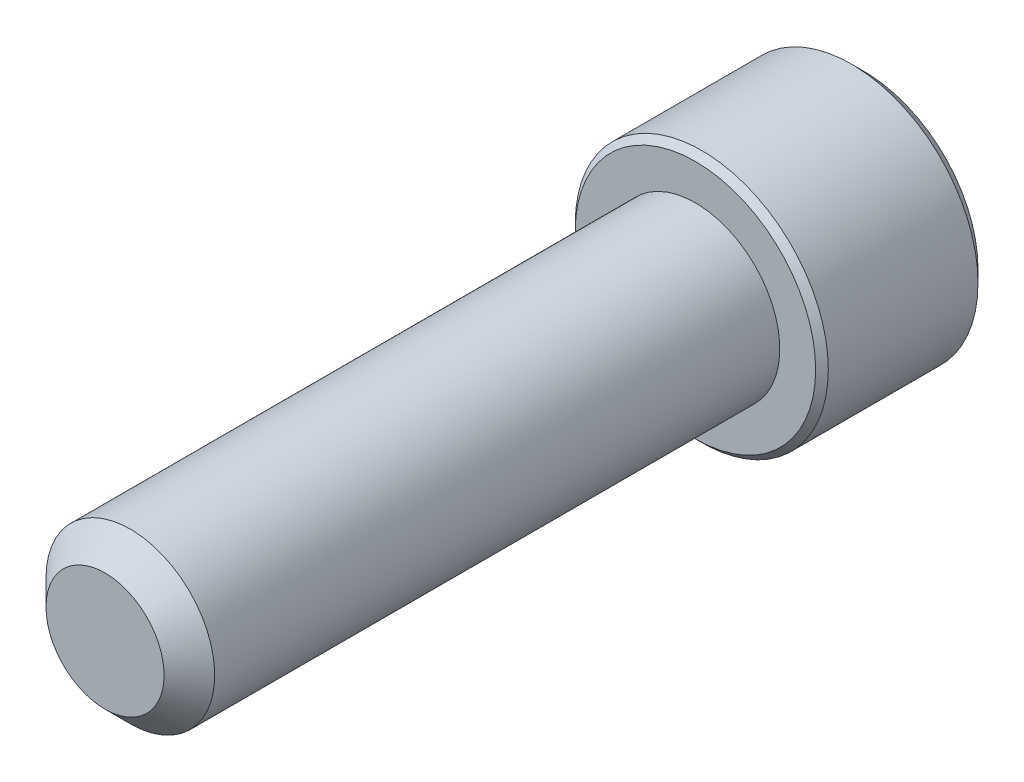
ISO-10303-21;
HEADER;
FILE_DESCRIPTION(('STEP AP214'),'2;1');
FILE_NAME('part.step','',(''),(''),'','','');
FILE_SCHEMA(('AUTOMOTIVE_DESIGN { 1 0 10303 214 1 1 1 1 }'));
ENDSEC;
DATA;
#1=APPLICATION_CONTEXT('core data for automotive mechanical design processes');
#2=APPLICATION_PROTOCOL_DEFINITION('international standard','automotive_design',2000,#1);
#3=PRODUCT_CONTEXT('',#1,'mechanical');
#4=PRODUCT('Part','Part','',(#3));
#5=PRODUCT_RELATED_PRODUCT_CATEGORY('part','',(#4));
#6=PRODUCT_DEFINITION_FORMATION('','',#4);
#7=PRODUCT_DEFINITION_CONTEXT('part definition',#1,'design');
#8=PRODUCT_DEFINITION('design','',#6,#7);
#9=PRODUCT_DEFINITION_SHAPE('','',#8);
#10=(LENGTH_UNIT() NAMED_UNIT(*) SI_UNIT(.MILLI.,.METRE.));
#11=(NAMED_UNIT(*) PLANE_ANGLE_UNIT() SI_UNIT($,.RADIAN.));
#12=(NAMED_UNIT(*) SI_UNIT($,.STERADIAN.) SOLID_ANGLE_UNIT());
#13=UNCERTAINTY_MEASURE_WITH_UNIT(LENGTH_MEASURE(1.E-05),#10,'distance_accuracy_value','');
#14=(GEOMETRIC_REPRESENTATION_CONTEXT(3) GLOBAL_UNCERTAINTY_ASSIGNED_CONTEXT((#13)) GLOBAL_UNIT_ASSIGNED_CONTEXT((#10,
#11,#12)) REPRESENTATION_CONTEXT('',''));
#15=CARTESIAN_POINT('',(0.,0.,0.));
#16=DIRECTION('',(0.,0.,1.));
#17=DIRECTION('',(1.,0.,0.));
#18=AXIS2_PLACEMENT_3D('',#15,#16,#17);
#19=CARTESIAN_POINT('',(0.,0.,-22.225));
#20=DIRECTION('',(0.,0.,1.));
#21=DIRECTION('',(1.,0.,0.));
#22=AXIS2_PLACEMENT_3D('',#19,#20,#21);
#23=CYLINDRICAL_SURFACE('',#22,3.175);
#24=CARTESIAN_POINT('',(0.,0.,-0.952500000000002));
#25=DIRECTION('',(0.,0.,1.));
#26=DIRECTION('',(1.,0.,0.));
#27=AXIS2_PLACEMENT_3D('',#24,#25,#26);
#28=CIRCLE('',#27,3.175);
#29=CARTESIAN_POINT('',(-3.175,0.,-0.952500000000002));
#30=VERTEX_POINT('',#29);
#31=EDGE_CURVE('E108',#30,#30,#28,.F.);
#32=ORIENTED_EDGE('',*,*,#31,.T.);
#33=EDGE_LOOP('',(#32));
#34=FACE_BOUND('',#33,.T.);
#35=CARTESIAN_POINT('',(0.,0.,-22.225));
#36=DIRECTION('',(0.,0.,-1.));
#37=DIRECTION('',(-1.,0.,0.));
#38=AXIS2_PLACEMENT_3D('',#35,#36,#37);
#39=CIRCLE('',#38,3.175);
#40=CARTESIAN_POINT('',(-3.175,0.,-22.225));
#41=VERTEX_POINT('',#40);
#42=EDGE_CURVE('E211',#41,#41,#39,.F.);
#43=ORIENTED_EDGE('',*,*,#42,.T.);
#44=EDGE_LOOP('',(#43));
#45=FACE_BOUND('',#44,.T.);
#46=ADVANCED_FACE('F34',(#34,#45),#23,.T.);
#47=CARTESIAN_POINT('',(0.,0.,0.));
#48=DIRECTION('',(0.,0.,1.));
#49=DIRECTION('',(1.,0.,0.));
#50=AXIS2_PLACEMENT_3D('',#47,#48,#49);
#51=PLANE('',#50);
#52=CARTESIAN_POINT('',(0.,0.,0.));
#53=DIRECTION('',(0.,0.,1.));
#54=DIRECTION('',(1.,0.,0.));
#55=AXIS2_PLACEMENT_3D('',#52,#53,#54);
#56=CIRCLE('',#55,2.2225);
#57=CARTESIAN_POINT('',(-2.2225,0.,0.));
#58=VERTEX_POINT('',#57);
#59=EDGE_CURVE('E210',#58,#58,#56,.T.);
#60=ORIENTED_EDGE('',*,*,#59,.T.);
#61=EDGE_LOOP('',(#60));
#62=FACE_BOUND('',#61,.T.);
#63=ADVANCED_FACE('F188',(#62),#51,.T.);
#64=CARTESIAN_POINT('',(0.,0.,0.));
#65=DIRECTION('',(0.,0.,-1.));
#66=DIRECTION('',(-1.,0.,0.));
#67=AXIS2_PLACEMENT_3D('',#64,#65,#66);
#68=CONICAL_SURFACE('',#67,2.2225,0.785398163397446);
#69=CARTESIAN_POINT('',(-3.175,0.,-0.952500000000002));
#70=CARTESIAN_POINT('',(-3.165078125,0.,-0.942578125000002));
#71=CARTESIAN_POINT('',(-3.15515625,0.,-0.932656250000002));
#72=CARTESIAN_POINT('',(-3.1353125,0.,-0.912812500000002));
#73=CARTESIAN_POINT('',(-3.125390625,0.,-0.902890625000002));
#74=CARTESIAN_POINT('',(-3.105546875,0.,-0.883046875000002));
#75=CARTESIAN_POINT('',(-3.095625,0.,-0.873125000000002));
#76=CARTESIAN_POINT('',(-3.07578125,0.,-0.853281250000002));
#77=CARTESIAN_POINT('',(-3.065859375,0.,-0.843359375000002));
#78=CARTESIAN_POINT('',(-3.046015625,0.,-0.823515625000002));
#79=CARTESIAN_POINT('',(-3.03609375,0.,-0.813593750000002));
#80=CARTESIAN_POINT('',(-3.01625,0.,-0.793750000000002));
#81=CARTESIAN_POINT('',(-3.006328125,0.,-0.783828125000002));
#82=CARTESIAN_POINT('',(-2.986484375,0.,-0.763984375000002));
#83=CARTESIAN_POINT('',(-2.9765625,0.,-0.754062500000002));
#84=CARTESIAN_POINT('',(-2.95671875,0.,-0.734218750000002));
#85=CARTESIAN_POINT('',(-2.946796875,0.,-0.724296875000002));
#86=CARTESIAN_POINT('',(-2.926953125,0.,-0.704453125000002));
#87=CARTESIAN_POINT('',(-2.91703125,0.,-0.694531250000002));
#88=CARTESIAN_POINT('',(-2.8971875,0.,-0.674687500000001));
#89=CARTESIAN_POINT('',(-2.887265625,0.,-0.664765625000001));
#90=CARTESIAN_POINT('',(-2.867421875,0.,-0.644921875000001));
#91=CARTESIAN_POINT('',(-2.8575,0.,-0.635000000000001));
#92=CARTESIAN_POINT('',(-2.83765625,0.,-0.615156250000001));
#93=CARTESIAN_POINT('',(-2.827734375,0.,-0.605234375000001));
#94=CARTESIAN_POINT('',(-2.807890625,0.,-0.585390625000001));
#95=CARTESIAN_POINT('',(-2.79796875,0.,-0.575468750000001));
#96=CARTESIAN_POINT('',(-2.778125,0.,-0.555625000000001));
#97=CARTESIAN_POINT('',(-2.768203125,0.,-0.545703125000001));
#98=CARTESIAN_POINT('',(-2.748359375,0.,-0.525859375000001));
#99=CARTESIAN_POINT('',(-2.7384375,0.,-0.515937500000001));
#100=CARTESIAN_POINT('',(-2.71859375,0.,-0.496093750000001));
#101=CARTESIAN_POINT('',(-2.708671875,0.,-0.486171875000001));
#102=CARTESIAN_POINT('',(-2.688828125,0.,-0.466328125000001));
#103=CARTESIAN_POINT('',(-2.67890625,0.,-0.456406250000001));
#104=CARTESIAN_POINT('',(-2.6590625,0.,-0.436562500000001));
#105=CARTESIAN_POINT('',(-2.649140625,0.,-0.426640625000001));
#106=CARTESIAN_POINT('',(-2.629296875,0.,-0.406796875000001));
#107=CARTESIAN_POINT('',(-2.619375,0.,-0.396875000000001));
#108=CARTESIAN_POINT('',(-2.59953125,0.,-0.377031250000001));
#109=CARTESIAN_POINT('',(-2.589609375,0.,-0.367109375000001));
#110=CARTESIAN_POINT('',(-2.569765625,0.,-0.347265625000001));
#111=CARTESIAN_POINT('',(-2.55984375,0.,-0.337343750000001));
#112=CARTESIAN_POINT('',(-2.54,0.,-0.317500000000001));
#113=CARTESIAN_POINT('',(-2.530078125,0.,-0.307578125000001));
#114=CARTESIAN_POINT('',(-2.510234375,0.,-0.287734375000001));
#115=CARTESIAN_POINT('',(-2.5003125,0.,-0.277812500000001));
#116=CARTESIAN_POINT('',(-2.48046875,0.,-0.257968750000001));
#117=CARTESIAN_POINT('',(-2.470546875,0.,-0.248046875));
#118=CARTESIAN_POINT('',(-2.450703125,0.,-0.228203125));
#119=CARTESIAN_POINT('',(-2.44078125,0.,-0.21828125));
#120=CARTESIAN_POINT('',(-2.4209375,0.,-0.1984375));
#121=CARTESIAN_POINT('',(-2.411015625,0.,-0.188515625));
#122=CARTESIAN_POINT('',(-2.391171875,0.,-0.168671875));
#123=CARTESIAN_POINT('',(-2.38125,0.,-0.15875));
#124=CARTESIAN_POINT('',(-2.36140625,0.,-0.13890625));
#125=CARTESIAN_POINT('',(-2.351484375,0.,-0.128984375));
#126=CARTESIAN_POINT('',(-2.331640625,0.,-0.109140625));
#127=CARTESIAN_POINT('',(-2.32171875,0.,-0.0992187500000001));
#128=CARTESIAN_POINT('',(-2.301875,0.,-0.0793750000000001));
#129=CARTESIAN_POINT('',(-2.291953125,0.,-0.0694531250000002));
#130=CARTESIAN_POINT('',(-2.272109375,0.,-0.0496093750000001));
#131=CARTESIAN_POINT('',(-2.2621875,0.,-0.0396875000000001));
#132=CARTESIAN_POINT('',(-2.24234375,0.,-0.01984375));
#133=CARTESIAN_POINT('',(-2.232421875,0.,-0.00992187499999998));
#134=CARTESIAN_POINT('',(-2.2225,0.,0.));
#135=B_SPLINE_CURVE_WITH_KNOTS('',3,(#69,#70,#71,#72,#73,#74,#75,#76,#77,#78,#79,#80,#81,#82,
#83,#84,#85,#86,#87,#88,#89,#90,#91,#92,#93,#94,#95,#96,#97,#98,#99,#100,#101,#102,#103,#104,
#105,#106,#107,#108,#109,#110,#111,#112,#113,#114,#115,#116,#117,#118,#119,#120,#121,#122,#123,
#124,#125,#126,#127,#128,#129,#130,#131,#132,#133,#134),.UNSPECIFIED.,.F.,.F.,(4,2,2,2,2,2,2,2,
2,2,2,2,2,2,2,2,2,2,2,2,2,2,2,2,2,2,2,2,2,2,2,2,4),(0.,0.0420949505675116,0.0841899011350232,
0.126284851702535,0.168379802270046,0.210474752837558,0.25256970340507,0.294664653972581,
0.336759604540093,0.378854555107605,0.420949505675116,0.463044456242628,0.50513940681014,
0.547234357377651,0.589329307945163,0.631424258512675,0.673519209080186,0.715614159647698,
0.75770911021521,0.799804060782721,0.841899011350233,0.883993961917745,0.926088912485256,
0.968183863052768,1.01027881362028,1.05237376418779,1.0944687147553,1.13656366532281,
1.17865861589033,1.22075356645784,1.26284851702535,1.30494346759286,1.34703841816037),.UNSPECIFIED.);
#136=EDGE_CURVE('BSEAM194',#30,#58,#135,.T.);
#137=ORIENTED_EDGE('',*,*,#31,.F.);
#138=ORIENTED_EDGE('',*,*,#59,.F.);
#139=ORIENTED_EDGE('',*,*,#136,.T.);
#140=ORIENTED_EDGE('',*,*,#136,.F.);
#141=EDGE_LOOP('',(#137,#139,#138,#140));
#142=FACE_BOUND('',#141,.T.);
#143=ADVANCED_FACE('F194',(#142),#68,.T.);
#144=CARTESIAN_POINT('',(0.,0.,-28.575));
#145=DIRECTION('',(0.,0.,1.));
#146=DIRECTION('',(1.,0.,0.));
#147=AXIS2_PLACEMENT_3D('',#144,#145,#146);
#148=CYLINDRICAL_SURFACE('',#147,4.7625);
#149=CARTESIAN_POINT('',(0.,0.,-22.463125));
#150=DIRECTION('',(0.,0.,-1.));
#151=DIRECTION('',(-1.,0.,0.));
#152=AXIS2_PLACEMENT_3D('',#149,#150,#151);
#153=CIRCLE('',#152,4.7625);
#154=CARTESIAN_POINT('',(-4.7625,0.,-22.463125));
#155=VERTEX_POINT('',#154);
#156=EDGE_CURVE('E42',#155,#155,#153,.T.);
#157=ORIENTED_EDGE('',*,*,#156,.T.);
#158=EDGE_LOOP('',(#157));
#159=FACE_BOUND('',#158,.T.);
#160=CARTESIAN_POINT('',(0.,0.,-28.09875));
#161=DIRECTION('',(0.,0.,-1.));
#162=DIRECTION('',(-1.,0.,0.));
#163=AXIS2_PLACEMENT_3D('',#160,#161,#162);
#164=CIRCLE('',#163,4.7625);
#165=CARTESIAN_POINT('',(4.7625,0.,-28.09875));
#166=VERTEX_POINT('',#165);
#167=EDGE_CURVE('E171',#166,#166,#164,.F.);
#168=ORIENTED_EDGE('',*,*,#167,.T.);
#169=EDGE_LOOP('',(#168));
#170=FACE_BOUND('',#169,.T.);
#171=ADVANCED_FACE('F176',(#159,#170),#148,.T.);
#172=CARTESIAN_POINT('',(0.,0.,-28.575));
#173=DIRECTION('',(0.,0.,-1.));
#174=DIRECTION('',(-1.,0.,0.));
#175=AXIS2_PLACEMENT_3D('',#172,#173,#174);
#176=PLANE('',#175);
#177=CARTESIAN_POINT('',(0.,0.,-28.575));
#178=DIRECTION('',(0.,0.,-1.));
#179=DIRECTION('',(-1.,0.,0.));
#180=AXIS2_PLACEMENT_3D('',#177,#178,#179);
#181=CIRCLE('',#180,4.28624999999999);
#182=CARTESIAN_POINT('',(4.28625,0.,-28.575));
#183=VERTEX_POINT('',#182);
#184=EDGE_CURVE('E107',#183,#183,#181,.T.);
#185=ORIENTED_EDGE('',*,*,#184,.T.);
#186=EDGE_LOOP('',(#185));
#187=FACE_BOUND('',#186,.T.);
#188=CARTESIAN_POINT('',(0.,0.,-28.575));
#189=DIRECTION('',(0.,0.,-1.));
#190=DIRECTION('',(-1.,0.,0.));
#191=AXIS2_PLACEMENT_3D('',#188,#189,#190);
#192=CIRCLE('',#191,2.74963065701559);
#193=CARTESIAN_POINT('',(-2.38125,1.37481532850779,-28.575));
#194=VERTEX_POINT('',#193);
#195=CARTESIAN_POINT('',(0.,2.74963065701559,-28.575));
#196=VERTEX_POINT('',#195);
#197=EDGE_CURVE('E88',#194,#196,#192,.T.);
#198=ORIENTED_EDGE('',*,*,#197,.F.);
#199=CARTESIAN_POINT('',(-2.38125,-1.3748153285078,-28.575));
#200=VERTEX_POINT('',#199);
#201=EDGE_CURVE('E48',#200,#194,#192,.T.);
#202=ORIENTED_EDGE('',*,*,#201,.F.);
#203=CARTESIAN_POINT('',(0.,-2.74963065701559,-28.575));
#204=VERTEX_POINT('',#203);
#205=EDGE_CURVE('E270',#204,#200,#192,.T.);
#206=ORIENTED_EDGE('',*,*,#205,.F.);
#207=CARTESIAN_POINT('',(2.38125,-1.3748153285078,-28.575));
#208=VERTEX_POINT('',#207);
#209=EDGE_CURVE('E55',#208,#204,#192,.T.);
#210=ORIENTED_EDGE('',*,*,#209,.F.);
#211=CARTESIAN_POINT('',(2.38125,1.3748153285078,-28.575));
#212=VERTEX_POINT('',#211);
#213=EDGE_CURVE('E129',#212,#208,#192,.T.);
#214=ORIENTED_EDGE('',*,*,#213,.F.);
#215=EDGE_CURVE('E97',#196,#212,#192,.T.);
#216=ORIENTED_EDGE('',*,*,#215,.F.);
#217=EDGE_LOOP('',(#198,#202,#206,#210,#214,#216));
#218=FACE_BOUND('',#217,.T.);
#219=ADVANCED_FACE('F128',(#187,#218),#176,.T.);
#220=CARTESIAN_POINT('',(0.,0.,-22.225));
#221=DIRECTION('',(0.,0.,-1.));
#222=DIRECTION('',(-1.,0.,0.));
#223=AXIS2_PLACEMENT_3D('',#220,#221,#222);
#224=PLANE('',#223);
#225=CARTESIAN_POINT('',(0.,0.,-22.225));
#226=DIRECTION('',(0.,0.,-1.));
#227=DIRECTION('',(-1.,0.,0.));
#228=AXIS2_PLACEMENT_3D('',#225,#226,#227);
#229=CIRCLE('',#228,4.524375);
#230=CARTESIAN_POINT('',(-4.524375,0.,-22.225));
#231=VERTEX_POINT('',#230);
#232=EDGE_CURVE('E11',#231,#231,#229,.F.);
#233=ORIENTED_EDGE('',*,*,#232,.T.);
#234=EDGE_LOOP('',(#233));
#235=FACE_BOUND('',#234,.T.);
#236=ORIENTED_EDGE('',*,*,#42,.F.);
#237=EDGE_LOOP('',(#236));
#238=FACE_BOUND('',#237,.T.);
#239=ADVANCED_FACE('F282',(#235,#238),#224,.F.);
#240=CARTESIAN_POINT('',(0.,0.,-28.575));
#241=DIRECTION('',(0.,0.,-1.));
#242=DIRECTION('',(-1.,0.,0.));
#243=AXIS2_PLACEMENT_3D('',#240,#241,#242);
#244=CONICAL_SURFACE('',#243,2.74963065701559,0.78539816339745);
#245=ORIENTED_EDGE('',*,*,#215,.T.);
#246=CARTESIAN_POINT('',(-0.000199999999998987,2.74974612706943,-28.5751154773272));
#247=CARTESIAN_POINT('',(0.0816567823790509,2.70248609172789,-28.5278948967095));
#248=CARTESIAN_POINT('',(0.164882333771761,2.65443579722785,-28.4834475752929));
#249=CARTESIAN_POINT('',(0.334588480838039,2.556455907536,-28.4020654569856));
#250=CARTESIAN_POINT('',(0.421085217353101,2.50651699342501,-28.3651759430951));
#251=CARTESIAN_POINT('',(0.59550177400904,2.40581754748857,-28.3019834131659));
#252=CARTESIAN_POINT('',(0.683377171180672,2.35508266327639,-28.2755215587295));
#253=CARTESIAN_POINT('',(0.861062594070873,2.25249593653966,-28.2347515156161));
#254=CARTESIAN_POINT('',(0.950867191185868,2.20064722822085,-28.2204128915305));
#255=CARTESIAN_POINT('',(1.10563960313034,2.11128933452158,-28.2074757847701));
#256=CARTESIAN_POINT('',(1.17040744896962,2.07389560129144,-28.2055606046532));
#257=CARTESIAN_POINT('',(1.29983727933557,1.99916925388849,-28.2087866227677));
#258=CARTESIAN_POINT('',(1.36449921879335,1.96183666573622,-28.2139302948571));
#259=CARTESIAN_POINT('',(1.49321254857739,1.88752399013711,-28.2309813108716));
#260=CARTESIAN_POINT('',(1.55726317423485,1.85054434417201,-28.2428962213493));
#261=CARTESIAN_POINT('',(1.68425683890527,1.77722451768917,-28.272835672352));
#262=CARTESIAN_POINT('',(1.74719996243582,1.74088428837517,-28.2908597445184));
#263=CARTESIAN_POINT('',(1.90842615073218,1.64780030516185,-28.3443688075524));
#264=CARTESIAN_POINT('',(2.00570949128784,1.59163374230437,-28.3838874208722));
#265=CARTESIAN_POINT('',(2.14875606262557,1.50904576583588,-28.4506003435508));
#266=CARTESIAN_POINT('',(2.19589628894396,1.4818293434813,-28.4740402091113));
#267=CARTESIAN_POINT('',(2.28930352636664,1.42790064981106,-28.5230566766595));
#268=CARTESIAN_POINT('',(2.33557105249682,1.40118808114506,-28.5486319667669));
#269=CARTESIAN_POINT('',(2.38145,1.37469985845396,-28.5751154773272));
#270=B_SPLINE_CURVE_WITH_KNOTS('',3,(#246,#247,#248,#249,#250,#251,#252,#253,#254,#255,#256,
#257,#258,#259,#260,#261,#262,#263,#264,#265,#266,#267,#268,#269),.UNSPECIFIED.,.F.,.F.,(4,2,2,
2,2,2,2,2,2,2,2,4),(0.,0.317196610611948,0.636241461041214,0.950218950629216,1.26340583824125,
1.48752413747843,1.71172100167746,1.93616888974081,2.16059957440835,2.51709639744762,
2.69486147369098,2.87251813383154),.UNSPECIFIED.);
#271=EDGE_CURVE('E102',#196,#212,#270,.T.);
#272=ORIENTED_EDGE('',*,*,#271,.F.);
#273=EDGE_LOOP('',(#245,#272));
#274=FACE_BOUND('',#273,.T.);
#275=ADVANCED_FACE('F103',(#274),#244,.F.);
#276=ORIENTED_EDGE('',*,*,#213,.T.);
#277=CARTESIAN_POINT('',(2.38125,-2.74194290589387,-29.4569808945799));
#278=CARTESIAN_POINT('',(2.38125,-2.6751796105604,-29.4065846679781));
#279=CARTESIAN_POINT('',(2.38125,-2.60804251112752,-29.3566755875907));
#280=CARTESIAN_POINT('',(2.38125,-2.47287325055307,-29.2580498309857));
#281=CARTESIAN_POINT('',(2.38125,-2.40484086895313,-29.2093334572448));
#282=CARTESIAN_POINT('',(2.38125,-2.26723593505441,-29.1129648544534));
#283=CARTESIAN_POINT('',(2.38125,-2.19765553346049,-29.0653237954326));
#284=CARTESIAN_POINT('',(2.38125,-2.05731367842204,-28.9718199233866));
#285=CARTESIAN_POINT('',(2.38125,-1.98655230892573,-28.9259569847287));
#286=CARTESIAN_POINT('',(2.38125,-1.83957751909226,-28.8338459007133));
#287=CARTESIAN_POINT('',(2.38125,-1.76328361992076,-28.7877255173928));
#288=CARTESIAN_POINT('',(2.38125,-1.6089135770446,-28.6985183038905));
#289=CARTESIAN_POINT('',(2.38125,-1.53083712149137,-28.6554320099754));
#290=CARTESIAN_POINT('',(2.38125,-1.37291620334514,-28.5732265014712));
#291=CARTESIAN_POINT('',(2.38125,-1.29307799938228,-28.5340953578519));
#292=CARTESIAN_POINT('',(2.38125,-1.13121425093133,-28.4606679503152));
#293=CARTESIAN_POINT('',(2.38125,-1.04918943681796,-28.4263700954538));
#294=CARTESIAN_POINT('',(2.38125,-0.889535256759274,-28.3663546314156));
#295=CARTESIAN_POINT('',(2.38125,-0.812083865770261,-28.340168478432));
#296=CARTESIAN_POINT('',(2.38125,-0.655316366527665,-28.2940097514868));
#297=CARTESIAN_POINT('',(2.38125,-0.576000130216834,-28.2740376055837));
#298=CARTESIAN_POINT('',(2.38125,-0.417295761573379,-28.2416821452488));
#299=CARTESIAN_POINT('',(2.38125,-0.33793457688385,-28.2291688083547));
#300=CARTESIAN_POINT('',(2.38125,-0.178363852969586,-28.2119738601659));
#301=CARTESIAN_POINT('',(2.38125,-0.0981544619617702,-28.2072909026126));
#302=CARTESIAN_POINT('',(2.38125,0.0594188034321256,-28.2061044408392));
#303=CARTESIAN_POINT('',(2.38125,0.136780588525989,-28.2093110105046));
#304=CARTESIAN_POINT('',(2.38125,0.290840960607335,-28.2230870567428));
#305=CARTESIAN_POINT('',(2.38125,0.367539482435406,-28.2336572485871));
#306=CARTESIAN_POINT('',(2.38125,0.521017492835386,-28.2617628298525));
#307=CARTESIAN_POINT('',(2.38125,0.597774958394047,-28.2794167489314));
#308=CARTESIAN_POINT('',(2.38125,0.749609814257008,-28.3207513962434));
#309=CARTESIAN_POINT('',(2.38125,0.824687344568025,-28.3444316201904));
#310=CARTESIAN_POINT('',(2.38125,1.06107814410025,-28.427894862956));
#311=CARTESIAN_POINT('',(2.38125,1.21904786221809,-28.4971839270396));
#312=CARTESIAN_POINT('',(2.38125,1.45021000267341,-28.6126640838597));
#313=CARTESIAN_POINT('',(2.38125,1.52644290442584,-28.6531730572583));
#314=CARTESIAN_POINT('',(2.38125,1.67717618538172,-28.7373026892371));
#315=CARTESIAN_POINT('',(2.38125,1.75167687358839,-28.7809227870999));
#316=CARTESIAN_POINT('',(2.38125,1.89548152088327,-28.868412556489));
#317=CARTESIAN_POINT('',(2.38125,1.96485959608998,-28.9121617927418));
#318=CARTESIAN_POINT('',(2.38125,2.10242624411168,-29.0015011587306));
#319=CARTESIAN_POINT('',(2.38125,2.17061472626633,-29.047091427904));
#320=CARTESIAN_POINT('',(2.38125,2.30540317317354,-29.1394060050932));
#321=CARTESIAN_POINT('',(2.38125,2.37201154222166,-29.1861180928962));
#322=CARTESIAN_POINT('',(2.38125,2.50431800054459,-29.2807775780183));
#323=CARTESIAN_POINT('',(2.38125,2.57001633510792,-29.3287246320963));
#324=CARTESIAN_POINT('',(2.38125,2.63533378855946,-29.3771767335425));
#325=B_SPLINE_CURVE_WITH_KNOTS('',3,(#277,#278,#279,#280,#281,#282,#283,#284,#285,#286,#287,
#288,#289,#290,#291,#292,#293,#294,#295,#296,#297,#298,#299,#300,#301,#302,#303,#304,#305,#306,
#307,#308,#309,#310,#311,#312,#313,#314,#315,#316,#317,#318,#319,#320,#321,#322,#323,#324),
.UNSPECIFIED.,.F.,.F.,(4,2,2,2,2,2,2,2,2,2,2,2,2,2,2,2,2,2,2,2,2,2,2,4),(0.,0.250951284009987,
0.501965564827884,0.75492477597359,1.00786608164542,1.27526207798892,1.54270521780083,
1.80931602029339,2.07583885812519,2.32089852590464,2.56597507114536,2.80664400307698,
3.04727155311265,3.27918940971451,3.51112979698762,3.74712477407483,3.98310000940112,
4.49898139184705,4.75794323931354,5.01685853149448,5.26288960015361,5.50893933794672,
5.75299038397142,5.9969743162797),.UNSPECIFIED.);
#326=EDGE_CURVE('E96',#212,#208,#325,.F.);
#327=ORIENTED_EDGE('',*,*,#326,.F.);
#328=EDGE_LOOP('',(#276,#327));
#329=FACE_BOUND('',#328,.T.);
#330=ADVANCED_FACE('F276',(#329),#244,.F.);
#331=ORIENTED_EDGE('',*,*,#209,.T.);
#332=CARTESIAN_POINT('',(2.38145,-1.37469985845396,-28.5751154773272));
#333=CARTESIAN_POINT('',(2.29959321762095,-1.4219598937955,-28.5278948967095));
#334=CARTESIAN_POINT('',(2.21636766622824,-1.47001018829554,-28.4834475752929));
#335=CARTESIAN_POINT('',(2.04666151916196,-1.56799007798739,-28.4020654569856));
#336=CARTESIAN_POINT('',(1.9601647826469,-1.61792899209838,-28.3651759430951));
#337=CARTESIAN_POINT('',(1.78574822599096,-1.71862843803482,-28.3019834131659));
#338=CARTESIAN_POINT('',(1.69787282881933,-1.769363322247,-28.2755215587295));
#339=CARTESIAN_POINT('',(1.52018740592913,-1.87195004898373,-28.2347515156161));
#340=CARTESIAN_POINT('',(1.43038280881413,-1.92379875730254,-28.2204128915305));
#341=CARTESIAN_POINT('',(1.27561039686966,-2.01315665100181,-28.2074757847701));
#342=CARTESIAN_POINT('',(1.21084255103038,-2.05055038423195,-28.2055606046532));
#343=CARTESIAN_POINT('',(1.08141272066443,-2.1252767316349,-28.2087866227677));
#344=CARTESIAN_POINT('',(1.01675078120665,-2.16260931978717,-28.2139302948571));
#345=CARTESIAN_POINT('',(0.888037451422604,-2.23692199538628,-28.2309813108716));
#346=CARTESIAN_POINT('',(0.823986825765147,-2.27390164135138,-28.2428962213493));
#347=CARTESIAN_POINT('',(0.696993161094727,-2.34722146783422,-28.272835672352));
#348=CARTESIAN_POINT('',(0.634050037564177,-2.38356169714822,-28.2908597445184));
#349=CARTESIAN_POINT('',(0.472823849267819,-2.47664568036154,-28.3443688075524));
#350=CARTESIAN_POINT('',(0.375540508712161,-2.53281224321902,-28.3838874208722));
#351=CARTESIAN_POINT('',(0.232493937374431,-2.61540021968751,-28.4506003435508));
#352=CARTESIAN_POINT('',(0.185353711056036,-2.6426166420421,-28.4740402091113));
#353=CARTESIAN_POINT('',(0.0919464736333626,-2.69654533571233,-28.5230566766595));
#354=CARTESIAN_POINT('',(0.045678947503179,-2.72325790437833,-28.5486319667669));
#355=CARTESIAN_POINT('',(-0.000200000000000156,-2.74974612706943,-28.5751154773272));
#356=B_SPLINE_CURVE_WITH_KNOTS('',3,(#332,#333,#334,#335,#336,#337,#338,#339,#340,#341,#342,
#343,#344,#345,#346,#347,#348,#349,#350,#351,#352,#353,#354,#355),.UNSPECIFIED.,.F.,.F.,(4,2,2,
2,2,2,2,2,2,2,2,4),(0.,0.317196610611949,0.636241461041218,0.950218950629221,1.26340583824126,
1.48752413747844,1.71172100167747,1.93616888974082,2.16059957440836,2.51709639744763,
2.69486147369099,2.87251813383154),.UNSPECIFIED.);
#357=EDGE_CURVE('E139',#208,#204,#356,.T.);
#358=ORIENTED_EDGE('',*,*,#357,.F.);
#359=EDGE_LOOP('',(#331,#358));
#360=FACE_BOUND('',#359,.T.);
#361=ADVANCED_FACE('F273',(#360),#244,.F.);
#362=ORIENTED_EDGE('',*,*,#205,.T.);
#363=CARTESIAN_POINT('',(0.000200000000001121,-2.74974612706943,-28.5751154773272));
#364=CARTESIAN_POINT('',(-0.0816567823790489,-2.70248609172789,-28.5278948967095));
#365=CARTESIAN_POINT('',(-0.164882333771759,-2.65443579722785,-28.4834475752929));
#366=CARTESIAN_POINT('',(-0.334588480838039,-2.556455907536,-28.4020654569856));
#367=CARTESIAN_POINT('',(-0.421085217353102,-2.50651699342501,-28.3651759430951));
#368=CARTESIAN_POINT('',(-0.595501774009041,-2.40581754748857,-28.3019834131659));
#369=CARTESIAN_POINT('',(-0.683377171180673,-2.35508266327639,-28.2755215587295));
#370=CARTESIAN_POINT('',(-0.861062594070874,-2.25249593653966,-28.2347515156161));
#371=CARTESIAN_POINT('',(-0.95086719118587,-2.20064722822085,-28.2204128915305));
#372=CARTESIAN_POINT('',(-1.10563960313034,-2.11128933452158,-28.2074757847701));
#373=CARTESIAN_POINT('',(-1.17040744896962,-2.07389560129144,-28.2055606046532));
#374=CARTESIAN_POINT('',(-1.29983727933557,-1.99916925388849,-28.2087866227677));
#375=CARTESIAN_POINT('',(-1.36449921879335,-1.96183666573622,-28.2139302948571));
#376=CARTESIAN_POINT('',(-1.4932125485774,-1.88752399013711,-28.2309813108716));
#377=CARTESIAN_POINT('',(-1.55726317423485,-1.85054434417201,-28.2428962213493));
#378=CARTESIAN_POINT('',(-1.68425683890527,-1.77722451768917,-28.272835672352));
#379=CARTESIAN_POINT('',(-1.74719996243582,-1.74088428837517,-28.2908597445184));
#380=CARTESIAN_POINT('',(-1.90842615073218,-1.64780030516185,-28.3443688075524));
#381=CARTESIAN_POINT('',(-2.00570949128784,-1.59163374230437,-28.3838874208722));
#382=CARTESIAN_POINT('',(-2.14875606262557,-1.50904576583588,-28.4506003435508));
#383=CARTESIAN_POINT('',(-2.19589628894397,-1.48182934348129,-28.4740402091113));
#384=CARTESIAN_POINT('',(-2.28930352636664,-1.42790064981105,-28.5230566766595));
#385=CARTESIAN_POINT('',(-2.33557105249682,-1.40118808114505,-28.5486319667669));
#386=CARTESIAN_POINT('',(-2.38145,-1.37469985845396,-28.5751154773272));
#387=B_SPLINE_CURVE_WITH_KNOTS('',3,(#363,#364,#365,#366,#367,#368,#369,#370,#371,#372,#373,
#374,#375,#376,#377,#378,#379,#380,#381,#382,#383,#384,#385,#386),.UNSPECIFIED.,.F.,.F.,(4,2,2,
2,2,2,2,2,2,2,2,4),(0.,0.317196610611951,0.636241461041219,0.950218950629222,1.26340583824126,
1.48752413747844,1.71172100167747,1.93616888974082,2.16059957440836,2.51709639744763,
2.69486147369099,2.87251813383154),.UNSPECIFIED.);
#388=EDGE_CURVE('E247',#204,#200,#387,.T.);
#389=ORIENTED_EDGE('',*,*,#388,.F.);
#390=EDGE_LOOP('',(#362,#389));
#391=FACE_BOUND('',#390,.T.);
#392=ADVANCED_FACE('F272',(#391),#244,.F.);
#393=ORIENTED_EDGE('',*,*,#201,.T.);
#394=CARTESIAN_POINT('',(-2.38125,-2.74194290629281,-29.4569808948811));
#395=CARTESIAN_POINT('',(-2.38125,-2.67517961094814,-29.4065846682677));
#396=CARTESIAN_POINT('',(-2.38125,-2.60804251150404,-29.3566755878687));
#397=CARTESIAN_POINT('',(-2.38125,-2.47287325090702,-29.2580498312406));
#398=CARTESIAN_POINT('',(-2.38125,-2.40484086929573,-29.2093334574882));
#399=CARTESIAN_POINT('',(-2.38125,-2.26723593537395,-29.1129648546737));
#400=CARTESIAN_POINT('',(-2.38125,-2.1976555337683,-29.0653237956413));
#401=CARTESIAN_POINT('',(-2.38125,-2.05731367870618,-28.9718199235723));
#402=CARTESIAN_POINT('',(-2.38125,-1.98655230919794,-28.925956984903));
#403=CARTESIAN_POINT('',(-2.38125,-1.83957751933871,-28.8338459008639));
#404=CARTESIAN_POINT('',(-2.38125,-1.76328362015337,-28.7877255175311));
#405=CARTESIAN_POINT('',(-2.38125,-1.60891357724904,-28.6985183040048));
#406=CARTESIAN_POINT('',(-2.38125,-1.53083712168147,-28.655432010078));
#407=CARTESIAN_POINT('',(-2.38125,-1.37291620350605,-28.5732265015513));
#408=CARTESIAN_POINT('',(-2.38125,-1.29307799952834,-28.5340953579213));
#409=CARTESIAN_POINT('',(-2.38125,-1.13121425104688,-28.4606679503644));
#410=CARTESIAN_POINT('',(-2.38125,-1.04918943691787,-28.4263700954936));
#411=CARTESIAN_POINT('',(-2.38125,-0.889535256852423,-28.3663546314484));
#412=CARTESIAN_POINT('',(-2.38125,-0.812083865872982,-28.3401684784655));
#413=CARTESIAN_POINT('',(-2.38125,-0.655316366649842,-28.2940097515196));
#414=CARTESIAN_POINT('',(-2.38125,-0.576000130348894,-28.2740376056151));
#415=CARTESIAN_POINT('',(-2.38125,-0.417295761724881,-28.2416821452753));
#416=CARTESIAN_POINT('',(-2.38125,-0.337934577044905,-28.2291688083777));
#417=CARTESIAN_POINT('',(-2.38125,-0.178363853149428,-28.2119738601797));
#418=CARTESIAN_POINT('',(-2.38125,-0.0981544621508447,-28.2072909026207));
#419=CARTESIAN_POINT('',(-2.38125,0.0594188032260155,-28.2061044408343));
#420=CARTESIAN_POINT('',(-2.38125,0.136780588312053,-28.2093110104925));
#421=CARTESIAN_POINT('',(-2.38125,0.290840960378528,-28.2230870567153));
#422=CARTESIAN_POINT('',(-2.38125,0.367539482199555,-28.2336572485512));
#423=CARTESIAN_POINT('',(-2.38125,0.52101749258563,-28.2617628297993));
#424=CARTESIAN_POINT('',(-2.38125,0.59777495813745,-28.2794167488691));
#425=CARTESIAN_POINT('',(-2.38125,0.749609813987392,-28.3207513961625));
#426=CARTESIAN_POINT('',(-2.38125,0.824687344292229,-28.3444316201001));
#427=CARTESIAN_POINT('',(-2.38125,1.0610781437644,-28.4278948628217));
#428=CARTESIAN_POINT('',(-2.38125,1.21904786183135,-28.4971839268647));
#429=CARTESIAN_POINT('',(-2.38125,1.45021000221341,-28.6126640836207));
#430=CARTESIAN_POINT('',(-2.38125,1.52644290394185,-28.6531730569973));
#431=CARTESIAN_POINT('',(-2.38125,1.67717618485052,-28.7373026889314));
#432=CARTESIAN_POINT('',(-2.38125,1.75167687303398,-28.7809227867715));
#433=CARTESIAN_POINT('',(-2.38125,1.89548152028666,-28.8684125561176));
#434=CARTESIAN_POINT('',(-2.38125,1.96485959547431,-28.91216179235));
#435=CARTESIAN_POINT('',(-2.38125,2.10242624345817,-29.0015011582982));
#436=CARTESIAN_POINT('',(-2.38125,2.17061472559402,-29.0470914274512));
#437=CARTESIAN_POINT('',(-2.38125,2.3054031724641,-29.1394060045998));
#438=CARTESIAN_POINT('',(-2.38125,2.37201154149389,-29.1861180923826));
#439=CARTESIAN_POINT('',(-2.38125,2.50431799978026,-29.2807775774644));
#440=CARTESIAN_POINT('',(-2.38125,2.57001633432538,-29.3287246315223));
#441=CARTESIAN_POINT('',(-2.38125,2.63533378775874,-29.3771767329484));
#442=B_SPLINE_CURVE_WITH_KNOTS('',3,(#394,#395,#396,#397,#398,#399,#400,#401,#402,#403,#404,
#405,#406,#407,#408,#409,#410,#411,#412,#413,#414,#415,#416,#417,#418,#419,#420,#421,#422,#423,
#424,#425,#426,#427,#428,#429,#430,#431,#432,#433,#434,#435,#436,#437,#438,#439,#440,#441),
.UNSPECIFIED.,.F.,.F.,(4,2,2,2,2,2,2,2,2,2,2,2,2,2,2,2,2,2,2,2,2,2,2,4),(0.,0.250951284057752,
0.501965564923429,0.754924776117815,1.00786608183832,1.2752620782364,1.54270521810291,
1.80931602064962,2.0758388585355,2.32089852628727,2.56597507150036,2.80664400340548,
3.04727155341465,3.27918940999226,3.51112979724109,3.74712477430216,3.98310000960233,
4.49898139186046,4.75794323923241,5.01685853131885,5.26288959989712,5.50893933760937,
5.7529903835543,5.99697431578282),.UNSPECIFIED.);
#443=EDGE_CURVE('E118',#200,#194,#442,.T.);
#444=ORIENTED_EDGE('',*,*,#443,.F.);
#445=EDGE_LOOP('',(#393,#444));
#446=FACE_BOUND('',#445,.T.);
#447=ADVANCED_FACE('F289',(#446),#244,.F.);
#448=ORIENTED_EDGE('',*,*,#197,.T.);
#449=CARTESIAN_POINT('',(-2.38145,1.37469985845396,-28.5751154773272));
#450=CARTESIAN_POINT('',(-2.29959321762095,1.4219598937955,-28.5278948967095));
#451=CARTESIAN_POINT('',(-2.21636766622824,1.47001018829554,-28.4834475752929));
#452=CARTESIAN_POINT('',(-2.04666151916196,1.56799007798739,-28.4020654569856));
#453=CARTESIAN_POINT('',(-1.9601647826469,1.61792899209838,-28.3651759430951));
#454=CARTESIAN_POINT('',(-1.78574822599096,1.71862843803482,-28.3019834131659));
#455=CARTESIAN_POINT('',(-1.69787282881932,1.769363322247,-28.2755215587295));
#456=CARTESIAN_POINT('',(-1.52018740592912,1.87195004898373,-28.2347515156161));
#457=CARTESIAN_POINT('',(-1.43038280881413,1.92379875730254,-28.2204128915305));
#458=CARTESIAN_POINT('',(-1.27561039686966,2.01315665100181,-28.2074757847701));
#459=CARTESIAN_POINT('',(-1.21084255103038,2.05055038423195,-28.2055606046532));
#460=CARTESIAN_POINT('',(-1.08141272066443,2.1252767316349,-28.2087866227677));
#461=CARTESIAN_POINT('',(-1.01675078120664,2.16260931978717,-28.2139302948571));
#462=CARTESIAN_POINT('',(-0.888037451422602,2.23692199538628,-28.2309813108716));
#463=CARTESIAN_POINT('',(-0.823986825765145,2.27390164135138,-28.2428962213493));
#464=CARTESIAN_POINT('',(-0.696993161094726,2.34722146783422,-28.272835672352));
#465=CARTESIAN_POINT('',(-0.634050037564175,2.38356169714822,-28.2908597445184));
#466=CARTESIAN_POINT('',(-0.472823849267818,2.47664568036154,-28.3443688075524));
#467=CARTESIAN_POINT('',(-0.37554050871216,2.53281224321902,-28.3838874208722));
#468=CARTESIAN_POINT('',(-0.23249393737443,2.61540021968751,-28.4506003435508));
#469=CARTESIAN_POINT('',(-0.185353711056035,2.64261664204209,-28.4740402091113));
#470=CARTESIAN_POINT('',(-0.0919464736333614,2.69654533571233,-28.5230566766595));
#471=CARTESIAN_POINT('',(-0.0456789475031782,2.72325790437833,-28.5486319667669));
#472=CARTESIAN_POINT('',(0.000200000000000673,2.74974612706943,-28.5751154773272));
#473=B_SPLINE_CURVE_WITH_KNOTS('',3,(#449,#450,#451,#452,#453,#454,#455,#456,#457,#458,#459,
#460,#461,#462,#463,#464,#465,#466,#467,#468,#469,#470,#471,#472),.UNSPECIFIED.,.F.,.F.,(4,2,2,
2,2,2,2,2,2,2,2,4),(0.,0.317196610611951,0.636241461041221,0.950218950629225,1.26340583824126,
1.48752413747844,1.71172100167747,1.93616888974082,2.16059957440836,2.51709639744763,
2.69486147369099,2.87251813383154),.UNSPECIFIED.);
#474=EDGE_CURVE('E92',#194,#196,#473,.T.);
#475=ORIENTED_EDGE('',*,*,#474,.F.);
#476=EDGE_LOOP('',(#448,#475));
#477=FACE_BOUND('',#476,.T.);
#478=ADVANCED_FACE('F90',(#477),#244,.F.);
#479=CARTESIAN_POINT('',(2.38125,4.12444598552339,-25.003125));
#480=DIRECTION('',(0.,0.,-1.));
#481=DIRECTION('',(-1.,0.,0.));
#482=AXIS2_PLACEMENT_3D('',#479,#480,#481);
#483=PLANE('',#482);
#484=DIRECTION('',(0.866025403784439,0.5,0.));
#485=VECTOR('',#484,1.);
#486=CARTESIAN_POINT('',(-2.38125,1.3748153285078,-25.003125));
#487=LINE('',#486,#485);
#488=CARTESIAN_POINT('',(-2.38125,1.3748153285078,-25.003125));
#489=VERTEX_POINT('',#488);
#490=CARTESIAN_POINT('',(0.,2.74963065701559,-25.003125));
#491=VERTEX_POINT('',#490);
#492=EDGE_CURVE('E117',#489,#491,#487,.T.);
#493=ORIENTED_EDGE('',*,*,#492,.T.);
#494=DIRECTION('',(0.866025403784439,-0.5,0.));
#495=VECTOR('',#494,1.);
#496=CARTESIAN_POINT('',(0.,2.74963065701559,-25.003125));
#497=LINE('',#496,#495);
#498=CARTESIAN_POINT('',(2.38125,1.3748153285078,-25.003125));
#499=VERTEX_POINT('',#498);
#500=EDGE_CURVE('E122',#491,#499,#497,.T.);
#501=ORIENTED_EDGE('',*,*,#500,.T.);
#502=DIRECTION('',(0.,-1.,0.));
#503=VECTOR('',#502,1.);
#504=CARTESIAN_POINT('',(2.38125,1.3748153285078,-25.003125));
#505=LINE('',#504,#503);
#506=CARTESIAN_POINT('',(2.38125,-1.3748153285078,-25.003125));
#507=VERTEX_POINT('',#506);
#508=EDGE_CURVE('E233',#499,#507,#505,.T.);
#509=ORIENTED_EDGE('',*,*,#508,.T.);
#510=DIRECTION('',(-0.866025403784439,-0.5,0.));
#511=VECTOR('',#510,1.);
#512=CARTESIAN_POINT('',(2.38125,-1.3748153285078,-25.003125));
#513=LINE('',#512,#511);
#514=CARTESIAN_POINT('',(0.,-2.74963065701559,-25.003125));
#515=VERTEX_POINT('',#514);
#516=EDGE_CURVE('E230',#507,#515,#513,.T.);
#517=ORIENTED_EDGE('',*,*,#516,.T.);
#518=DIRECTION('',(-0.866025403784439,0.5,0.));
#519=VECTOR('',#518,1.);
#520=CARTESIAN_POINT('',(0.,-2.74963065701559,-25.003125));
#521=LINE('',#520,#519);
#522=CARTESIAN_POINT('',(-2.38125,-1.3748153285078,-25.003125));
#523=VERTEX_POINT('',#522);
#524=EDGE_CURVE('E227',#515,#523,#521,.T.);
#525=ORIENTED_EDGE('',*,*,#524,.T.);
#526=DIRECTION('',(0.,1.,0.));
#527=VECTOR('',#526,1.);
#528=CARTESIAN_POINT('',(-2.38125,-1.3748153285078,-25.003125));
#529=LINE('',#528,#527);
#530=EDGE_CURVE('E125',#523,#489,#529,.T.);
#531=ORIENTED_EDGE('',*,*,#530,.T.);
#532=EDGE_LOOP('',(#493,#501,#509,#517,#525,#531));
#533=FACE_BOUND('',#532,.T.);
#534=ADVANCED_FACE('F159',(#533),#483,.T.);
#535=CARTESIAN_POINT('',(0.,2.74963065701559,-25.003125));
#536=DIRECTION('',(0.5,0.866025403784439,0.));
#537=DIRECTION('',(-0.866025403784439,0.5,0.));
#538=AXIS2_PLACEMENT_3D('',#535,#536,#537);
#539=PLANE('',#538);
#540=DIRECTION('',(0.,0.,-1.));
#541=VECTOR('',#540,1.);
#542=CARTESIAN_POINT('',(0.,2.74963065701559,-25.003125));
#543=LINE('',#542,#541);
#544=EDGE_CURVE('E114',#491,#196,#543,.T.);
#545=ORIENTED_EDGE('',*,*,#544,.T.);
#546=ORIENTED_EDGE('',*,*,#271,.T.);
#547=DIRECTION('',(0.,0.,-1.));
#548=VECTOR('',#547,1.);
#549=CARTESIAN_POINT('',(2.38125,1.3748153285078,-25.003125));
#550=LINE('',#549,#548);
#551=EDGE_CURVE('E124',#499,#212,#550,.T.);
#552=ORIENTED_EDGE('',*,*,#551,.F.);
#553=ORIENTED_EDGE('',*,*,#500,.F.);
#554=EDGE_LOOP('',(#545,#546,#552,#553));
#555=FACE_BOUND('',#554,.T.);
#556=ADVANCED_FACE('F120',(#555),#539,.F.);
#557=CARTESIAN_POINT('',(2.38125,1.3748153285078,-25.003125));
#558=DIRECTION('',(1.,0.,0.));
#559=DIRECTION('',(0.,1.,0.));
#560=AXIS2_PLACEMENT_3D('',#557,#558,#559);
#561=PLANE('',#560);
#562=ORIENTED_EDGE('',*,*,#551,.T.);
#563=ORIENTED_EDGE('',*,*,#326,.T.);
#564=DIRECTION('',(0.,0.,-1.));
#565=VECTOR('',#564,1.);
#566=CARTESIAN_POINT('',(2.38125,-1.3748153285078,-25.003125));
#567=LINE('',#566,#565);
#568=EDGE_CURVE('E216',#507,#208,#567,.T.);
#569=ORIENTED_EDGE('',*,*,#568,.F.);
#570=ORIENTED_EDGE('',*,*,#508,.F.);
#571=EDGE_LOOP('',(#562,#563,#569,#570));
#572=FACE_BOUND('',#571,.T.);
#573=ADVANCED_FACE('F148',(#572),#561,.F.);
#574=CARTESIAN_POINT('',(2.38125,-1.3748153285078,-25.003125));
#575=DIRECTION('',(0.5,-0.866025403784439,0.));
#576=DIRECTION('',(0.866025403784439,0.5,0.));
#577=AXIS2_PLACEMENT_3D('',#574,#575,#576);
#578=PLANE('',#577);
#579=ORIENTED_EDGE('',*,*,#568,.T.);
#580=ORIENTED_EDGE('',*,*,#357,.T.);
#581=DIRECTION('',(0.,0.,-1.));
#582=VECTOR('',#581,1.);
#583=CARTESIAN_POINT('',(0.,-2.74963065701559,-25.003125));
#584=LINE('',#583,#582);
#585=EDGE_CURVE('E219',#515,#204,#584,.T.);
#586=ORIENTED_EDGE('',*,*,#585,.F.);
#587=ORIENTED_EDGE('',*,*,#516,.F.);
#588=EDGE_LOOP('',(#579,#580,#586,#587));
#589=FACE_BOUND('',#588,.T.);
#590=ADVANCED_FACE('F152',(#589),#578,.F.);
#591=CARTESIAN_POINT('',(0.,-2.74963065701559,-25.003125));
#592=DIRECTION('',(-0.5,-0.866025403784439,0.));
#593=DIRECTION('',(0.866025403784439,-0.5,0.));
#594=AXIS2_PLACEMENT_3D('',#591,#592,#593);
#595=PLANE('',#594);
#596=ORIENTED_EDGE('',*,*,#585,.T.);
#597=ORIENTED_EDGE('',*,*,#388,.T.);
#598=DIRECTION('',(0.,0.,-1.));
#599=VECTOR('',#598,1.);
#600=CARTESIAN_POINT('',(-2.38125,-1.3748153285078,-25.003125));
#601=LINE('',#600,#599);
#602=EDGE_CURVE('E222',#523,#200,#601,.T.);
#603=ORIENTED_EDGE('',*,*,#602,.F.);
#604=ORIENTED_EDGE('',*,*,#524,.F.);
#605=EDGE_LOOP('',(#596,#597,#603,#604));
#606=FACE_BOUND('',#605,.T.);
#607=ADVANCED_FACE('F255',(#606),#595,.F.);
#608=CARTESIAN_POINT('',(-2.38125,-1.3748153285078,-25.003125));
#609=DIRECTION('',(-1.,0.,0.));
#610=DIRECTION('',(0.,-1.,0.));
#611=AXIS2_PLACEMENT_3D('',#608,#609,#610);
#612=PLANE('',#611);
#613=ORIENTED_EDGE('',*,*,#602,.T.);
#614=ORIENTED_EDGE('',*,*,#443,.T.);
#615=DIRECTION('',(0.,0.,-1.));
#616=VECTOR('',#615,1.);
#617=CARTESIAN_POINT('',(-2.38125,1.3748153285078,-25.003125));
#618=LINE('',#617,#616);
#619=EDGE_CURVE('E116',#489,#194,#618,.T.);
#620=ORIENTED_EDGE('',*,*,#619,.F.);
#621=ORIENTED_EDGE('',*,*,#530,.F.);
#622=EDGE_LOOP('',(#613,#614,#620,#621));
#623=FACE_BOUND('',#622,.T.);
#624=ADVANCED_FACE('F252',(#623),#612,.F.);
#625=CARTESIAN_POINT('',(-2.38125,1.3748153285078,-25.003125));
#626=DIRECTION('',(-0.5,0.866025403784439,0.));
#627=DIRECTION('',(-0.866025403784439,-0.5,0.));
#628=AXIS2_PLACEMENT_3D('',#625,#626,#627);
#629=PLANE('',#628);
#630=ORIENTED_EDGE('',*,*,#619,.T.);
#631=ORIENTED_EDGE('',*,*,#474,.T.);
#632=ORIENTED_EDGE('',*,*,#544,.F.);
#633=ORIENTED_EDGE('',*,*,#492,.F.);
#634=EDGE_LOOP('',(#630,#631,#632,#633));
#635=FACE_BOUND('',#634,.T.);
#636=ADVANCED_FACE('F112',(#635),#629,.F.);
#637=CARTESIAN_POINT('',(0.,0.,-28.575));
#638=DIRECTION('',(0.,0.,1.));
#639=DIRECTION('',(1.,0.,0.));
#640=AXIS2_PLACEMENT_3D('',#637,#638,#639);
#641=CONICAL_SURFACE('',#640,4.28624999999999,0.785398163397442);
#642=CARTESIAN_POINT('',(4.7625,0.,-28.09875));
#643=CARTESIAN_POINT('',(4.7575390625,0.,-28.1037109375));
#644=CARTESIAN_POINT('',(4.752578125,0.,-28.108671875));
#645=CARTESIAN_POINT('',(4.74265625,0.,-28.11859375));
#646=CARTESIAN_POINT('',(4.7376953125,0.,-28.1235546875));
#647=CARTESIAN_POINT('',(4.7277734375,0.,-28.1334765625));
#648=CARTESIAN_POINT('',(4.7228125,0.,-28.1384375));
#649=CARTESIAN_POINT('',(4.712890625,0.,-28.148359375));
#650=CARTESIAN_POINT('',(4.7079296875,0.,-28.1533203125));
#651=CARTESIAN_POINT('',(4.6980078125,0.,-28.1632421875));
#652=CARTESIAN_POINT('',(4.693046875,0.,-28.168203125));
#653=CARTESIAN_POINT('',(4.683125,0.,-28.178125));
#654=CARTESIAN_POINT('',(4.6781640625,0.,-28.1830859375));
#655=CARTESIAN_POINT('',(4.6682421875,0.,-28.1930078125));
#656=CARTESIAN_POINT('',(4.66328125,0.,-28.19796875));
#657=CARTESIAN_POINT('',(4.653359375,0.,-28.207890625));
#658=CARTESIAN_POINT('',(4.6483984375,0.,-28.2128515625));
#659=CARTESIAN_POINT('',(4.6384765625,0.,-28.2227734375));
#660=CARTESIAN_POINT('',(4.633515625,0.,-28.227734375));
#661=CARTESIAN_POINT('',(4.62359375,0.,-28.23765625));
#662=CARTESIAN_POINT('',(4.6186328125,0.,-28.2426171875));
#663=CARTESIAN_POINT('',(4.6087109375,0.,-28.2525390625));
#664=CARTESIAN_POINT('',(4.60375,0.,-28.2575));
#665=CARTESIAN_POINT('',(4.593828125,0.,-28.267421875));
#666=CARTESIAN_POINT('',(4.5888671875,0.,-28.2723828125));
#667=CARTESIAN_POINT('',(4.5789453125,0.,-28.2823046875));
#668=CARTESIAN_POINT('',(4.573984375,0.,-28.287265625));
#669=CARTESIAN_POINT('',(4.5640625,0.,-28.2971875));
#670=CARTESIAN_POINT('',(4.5591015625,0.,-28.3021484375));
#671=CARTESIAN_POINT('',(4.5491796875,0.,-28.3120703125));
#672=CARTESIAN_POINT('',(4.54421875,0.,-28.31703125));
#673=CARTESIAN_POINT('',(4.534296875,0.,-28.326953125));
#674=CARTESIAN_POINT('',(4.5293359375,0.,-28.3319140625));
#675=CARTESIAN_POINT('',(4.5194140625,0.,-28.3418359375));
#676=CARTESIAN_POINT('',(4.514453125,0.,-28.346796875));
#677=CARTESIAN_POINT('',(4.50453125,0.,-28.35671875));
#678=CARTESIAN_POINT('',(4.4995703125,0.,-28.3616796875));
#679=CARTESIAN_POINT('',(4.4896484375,0.,-28.3716015625));
#680=CARTESIAN_POINT('',(4.4846875,0.,-28.3765625));
#681=CARTESIAN_POINT('',(4.474765625,0.,-28.386484375));
#682=CARTESIAN_POINT('',(4.4698046875,0.,-28.3914453125));
#683=CARTESIAN_POINT('',(4.4598828125,0.,-28.4013671875));
#684=CARTESIAN_POINT('',(4.454921875,0.,-28.406328125));
#685=CARTESIAN_POINT('',(4.445,0.,-28.41625));
#686=CARTESIAN_POINT('',(4.4400390625,0.,-28.4212109375));
#687=CARTESIAN_POINT('',(4.4301171875,0.,-28.4311328125));
#688=CARTESIAN_POINT('',(4.42515625,0.,-28.43609375));
#689=CARTESIAN_POINT('',(4.415234375,0.,-28.446015625));
#690=CARTESIAN_POINT('',(4.4102734375,0.,-28.4509765625));
#691=CARTESIAN_POINT('',(4.4003515625,0.,-28.4608984375));
#692=CARTESIAN_POINT('',(4.395390625,0.,-28.465859375));
#693=CARTESIAN_POINT('',(4.38546875,0.,-28.47578125));
#694=CARTESIAN_POINT('',(4.3805078125,0.,-28.4807421875));
#695=CARTESIAN_POINT('',(4.3705859375,0.,-28.4906640625));
#696=CARTESIAN_POINT('',(4.365625,0.,-28.495625));
#697=CARTESIAN_POINT('',(4.355703125,0.,-28.505546875));
#698=CARTESIAN_POINT('',(4.3507421875,0.,-28.5105078125));
#699=CARTESIAN_POINT('',(4.3408203125,0.,-28.5204296875));
#700=CARTESIAN_POINT('',(4.335859375,0.,-28.525390625));
#701=CARTESIAN_POINT('',(4.3259375,0.,-28.5353125));
#702=CARTESIAN_POINT('',(4.3209765625,0.,-28.5402734375));
#703=CARTESIAN_POINT('',(4.3110546875,0.,-28.5501953125));
#704=CARTESIAN_POINT('',(4.30609375,0.,-28.55515625));
#705=CARTESIAN_POINT('',(4.296171875,0.,-28.565078125));
#706=CARTESIAN_POINT('',(4.2912109375,0.,-28.5700390625));
#707=CARTESIAN_POINT('',(4.28625,0.,-28.575));
#708=B_SPLINE_CURVE_WITH_KNOTS('',3,(#642,#643,#644,#645,#646,#647,#648,#649,#650,#651,#652,
#653,#654,#655,#656,#657,#658,#659,#660,#661,#662,#663,#664,#665,#666,#667,#668,#669,#670,#671,
#672,#673,#674,#675,#676,#677,#678,#679,#680,#681,#682,#683,#684,#685,#686,#687,#688,#689,#690,
#691,#692,#693,#694,#695,#696,#697,#698,#699,#700,#701,#702,#703,#704,#705,#706,#707),
.UNSPECIFIED.,.F.,.F.,(4,2,2,2,2,2,2,2,2,2,2,2,2,2,2,2,2,2,2,2,2,2,2,2,2,2,2,2,2,2,2,2,4),(0.,
0.0210474752837576,0.0420949505675121,0.0631424258512696,0.0841899011350247,0.105237376418782,
0.126284851702537,0.147332326986294,0.168379802270049,0.189427277553807,0.210474752837562,
0.231522228121319,0.252569703405077,0.273617178688832,0.294664653972587,0.315712129256344,
0.336759604540099,0.357807079823856,0.378854555107612,0.399902030391369,0.420949505675124,
0.441996980958881,0.463044456242636,0.484091931526394,0.505139406810151,0.526186882093907,
0.547234357377664,0.568281832661419,0.589329307945176,0.610376783228931,0.631424258512688,
0.652471733796444,0.673519209080201),.UNSPECIFIED.);
#709=EDGE_CURVE('BSEAM180',#166,#183,#708,.T.);
#710=ORIENTED_EDGE('',*,*,#167,.F.);
#711=ORIENTED_EDGE('',*,*,#184,.F.);
#712=ORIENTED_EDGE('',*,*,#709,.T.);
#713=ORIENTED_EDGE('',*,*,#709,.F.);
#714=EDGE_LOOP('',(#710,#712,#711,#713));
#715=FACE_BOUND('',#714,.T.);
#716=ADVANCED_FACE('F180',(#715),#641,.T.);
#717=CARTESIAN_POINT('',(0.,0.,-22.463125));
#718=DIRECTION('',(0.,0.,-1.));
#719=DIRECTION('',(-1.,0.,0.));
#720=AXIS2_PLACEMENT_3D('',#717,#718,#719);
#721=CONICAL_SURFACE('',#720,4.7625,0.785398163397443);
#722=ORIENTED_EDGE('',*,*,#232,.F.);
#723=EDGE_LOOP('',(#722));
#724=FACE_BOUND('',#723,.T.);
#725=ORIENTED_EDGE('',*,*,#156,.F.);
#726=EDGE_LOOP('',(#725));
#727=FACE_BOUND('',#726,.T.);
#728=ADVANCED_FACE('F36',(#724,#727),#721,.T.);
#729=CLOSED_SHELL('',(#46,#63,#143,#171,#219,#239,#275,#330,#361,#392,#447,#478,#534,#556,#573,
#590,#607,#624,#636,#716,#728));
#730=MANIFOLD_SOLID_BREP('B2',#729);
#731=ADVANCED_BREP_SHAPE_REPRESENTATION('',(#18,#730),#14);
#732=SHAPE_DEFINITION_REPRESENTATION(#9,#731);
ENDSEC;
END-ISO-10303-21;
